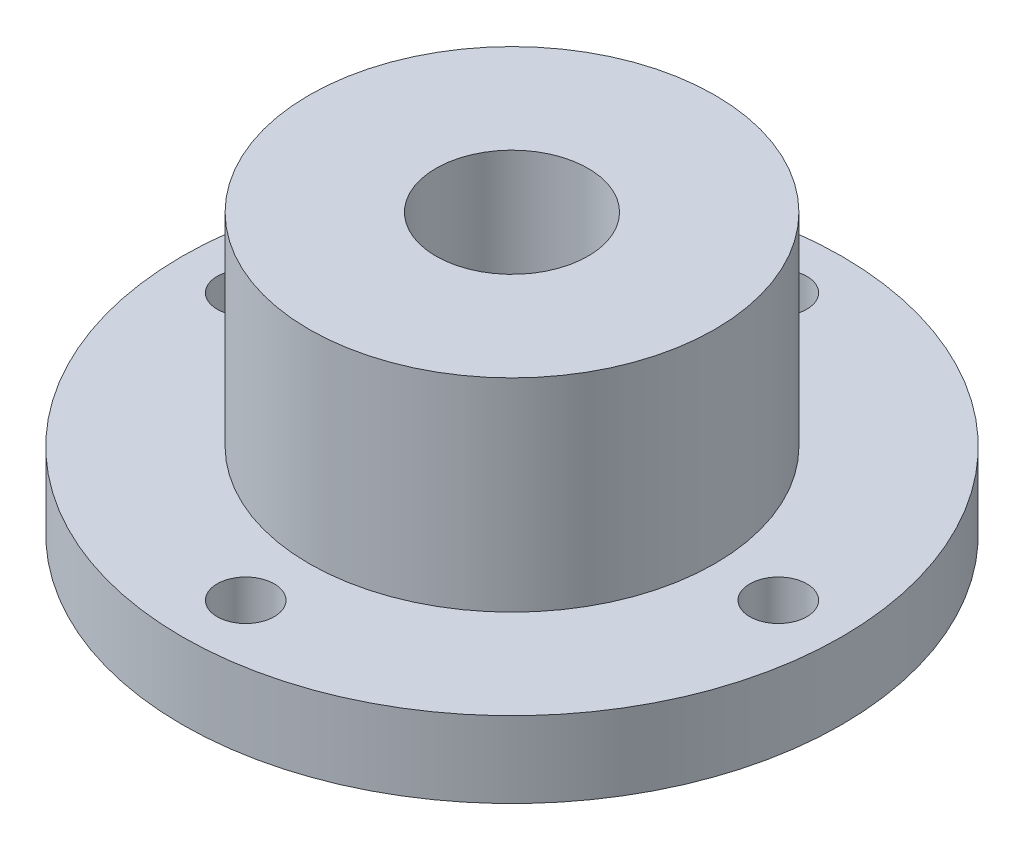
ISO-10303-21;
HEADER;
FILE_DESCRIPTION(('STEP AP214'),'2;1');
FILE_NAME('part.step','',(''),(''),'','','');
FILE_SCHEMA(('AUTOMOTIVE_DESIGN { 1 0 10303 214 1 1 1 1 }'));
ENDSEC;
DATA;
#1=APPLICATION_CONTEXT('core data for automotive mechanical design processes');
#2=APPLICATION_PROTOCOL_DEFINITION('international standard','automotive_design',2000,#1);
#3=PRODUCT_CONTEXT('',#1,'mechanical');
#4=PRODUCT('Part','Part','',(#3));
#5=PRODUCT_RELATED_PRODUCT_CATEGORY('part','',(#4));
#6=PRODUCT_DEFINITION_FORMATION('','',#4);
#7=PRODUCT_DEFINITION_CONTEXT('part definition',#1,'design');
#8=PRODUCT_DEFINITION('design','',#6,#7);
#9=PRODUCT_DEFINITION_SHAPE('','',#8);
#10=(LENGTH_UNIT() NAMED_UNIT(*) SI_UNIT(.MILLI.,.METRE.));
#11=(NAMED_UNIT(*) PLANE_ANGLE_UNIT() SI_UNIT($,.RADIAN.));
#12=(NAMED_UNIT(*) SI_UNIT($,.STERADIAN.) SOLID_ANGLE_UNIT());
#13=UNCERTAINTY_MEASURE_WITH_UNIT(LENGTH_MEASURE(1.E-05),#10,'distance_accuracy_value','');
#14=(GEOMETRIC_REPRESENTATION_CONTEXT(3) GLOBAL_UNCERTAINTY_ASSIGNED_CONTEXT((#13)) GLOBAL_UNIT_ASSIGNED_CONTEXT((#10,
#11,#12)) REPRESENTATION_CONTEXT('',''));
#15=CARTESIAN_POINT('',(0.,0.,0.));
#16=DIRECTION('',(0.,0.,1.));
#17=DIRECTION('',(1.,0.,0.));
#18=AXIS2_PLACEMENT_3D('',#15,#16,#17);
#19=CARTESIAN_POINT('',(-21.,6.,0.));
#20=DIRECTION('',(0.,-1.,0.));
#21=DIRECTION('',(0.,0.,-1.));
#22=AXIS2_PLACEMENT_3D('',#19,#20,#21);
#23=CYLINDRICAL_SURFACE('',#22,2.25);
#24=CARTESIAN_POINT('',(-21.,6.,0.));
#25=DIRECTION('',(0.,1.,0.));
#26=DIRECTION('',(0.,0.,1.));
#27=AXIS2_PLACEMENT_3D('',#24,#25,#26);
#28=CIRCLE('',#27,2.25);
#29=CARTESIAN_POINT('',(-21.,6.,2.25));
#30=VERTEX_POINT('',#29);
#31=EDGE_CURVE('E52',#30,#30,#28,.T.);
#32=ORIENTED_EDGE('',*,*,#31,.T.);
#33=EDGE_LOOP('',(#32));
#34=FACE_BOUND('',#33,.T.);
#35=CARTESIAN_POINT('',(-21.,0.,0.));
#36=DIRECTION('',(0.,1.,0.));
#37=DIRECTION('',(0.,0.,1.));
#38=AXIS2_PLACEMENT_3D('',#35,#36,#37);
#39=CIRCLE('',#38,2.25);
#40=CARTESIAN_POINT('',(-21.,0.,2.25));
#41=VERTEX_POINT('',#40);
#42=EDGE_CURVE('E68',#41,#41,#39,.T.);
#43=ORIENTED_EDGE('',*,*,#42,.F.);
#44=EDGE_LOOP('',(#43));
#45=FACE_BOUND('',#44,.T.);
#46=ADVANCED_FACE('F37',(#34,#45),#23,.F.);
#47=CARTESIAN_POINT('',(0.,6.,-21.));
#48=DIRECTION('',(0.,-1.,0.));
#49=DIRECTION('',(0.,0.,-1.));
#50=AXIS2_PLACEMENT_3D('',#47,#48,#49);
#51=CYLINDRICAL_SURFACE('',#50,2.25);
#52=CARTESIAN_POINT('',(0.,6.,-21.));
#53=DIRECTION('',(0.,1.,0.));
#54=DIRECTION('',(0.,0.,1.));
#55=AXIS2_PLACEMENT_3D('',#52,#53,#54);
#56=CIRCLE('',#55,2.25);
#57=CARTESIAN_POINT('',(0.,6.,-18.75));
#58=VERTEX_POINT('',#57);
#59=EDGE_CURVE('E86',#58,#58,#56,.T.);
#60=ORIENTED_EDGE('',*,*,#59,.T.);
#61=EDGE_LOOP('',(#60));
#62=FACE_BOUND('',#61,.T.);
#63=CARTESIAN_POINT('',(0.,0.,-21.));
#64=DIRECTION('',(0.,1.,0.));
#65=DIRECTION('',(0.,0.,1.));
#66=AXIS2_PLACEMENT_3D('',#63,#64,#65);
#67=CIRCLE('',#66,2.25);
#68=CARTESIAN_POINT('',(0.,0.,-18.75));
#69=VERTEX_POINT('',#68);
#70=EDGE_CURVE('E65',#69,#69,#67,.T.);
#71=ORIENTED_EDGE('',*,*,#70,.F.);
#72=EDGE_LOOP('',(#71));
#73=FACE_BOUND('',#72,.T.);
#74=ADVANCED_FACE('F138',(#62,#73),#51,.F.);
#75=CARTESIAN_POINT('',(21.,6.,0.));
#76=DIRECTION('',(0.,-1.,0.));
#77=DIRECTION('',(0.,0.,-1.));
#78=AXIS2_PLACEMENT_3D('',#75,#76,#77);
#79=CYLINDRICAL_SURFACE('',#78,2.25);
#80=CARTESIAN_POINT('',(21.,6.,0.));
#81=DIRECTION('',(0.,1.,0.));
#82=DIRECTION('',(0.,0.,1.));
#83=AXIS2_PLACEMENT_3D('',#80,#81,#82);
#84=CIRCLE('',#83,2.25);
#85=CARTESIAN_POINT('',(21.,6.,2.25));
#86=VERTEX_POINT('',#85);
#87=EDGE_CURVE('E80',#86,#86,#84,.T.);
#88=ORIENTED_EDGE('',*,*,#87,.T.);
#89=EDGE_LOOP('',(#88));
#90=FACE_BOUND('',#89,.T.);
#91=CARTESIAN_POINT('',(21.,0.,0.));
#92=DIRECTION('',(0.,1.,0.));
#93=DIRECTION('',(0.,0.,1.));
#94=AXIS2_PLACEMENT_3D('',#91,#92,#93);
#95=CIRCLE('',#94,2.25);
#96=CARTESIAN_POINT('',(21.,0.,2.25));
#97=VERTEX_POINT('',#96);
#98=EDGE_CURVE('E60',#97,#97,#95,.T.);
#99=ORIENTED_EDGE('',*,*,#98,.F.);
#100=EDGE_LOOP('',(#99));
#101=FACE_BOUND('',#100,.T.);
#102=ADVANCED_FACE('F143',(#90,#101),#79,.F.);
#103=CARTESIAN_POINT('',(0.,6.,21.));
#104=DIRECTION('',(0.,-1.,0.));
#105=DIRECTION('',(0.,0.,-1.));
#106=AXIS2_PLACEMENT_3D('',#103,#104,#105);
#107=CYLINDRICAL_SURFACE('',#106,2.25);
#108=CARTESIAN_POINT('',(0.,6.,21.));
#109=DIRECTION('',(0.,1.,0.));
#110=DIRECTION('',(0.,0.,1.));
#111=AXIS2_PLACEMENT_3D('',#108,#109,#110);
#112=CIRCLE('',#111,2.25);
#113=CARTESIAN_POINT('',(0.,6.,23.25));
#114=VERTEX_POINT('',#113);
#115=EDGE_CURVE('E75',#114,#114,#112,.T.);
#116=ORIENTED_EDGE('',*,*,#115,.T.);
#117=EDGE_LOOP('',(#116));
#118=FACE_BOUND('',#117,.T.);
#119=CARTESIAN_POINT('',(0.,0.,21.));
#120=DIRECTION('',(0.,1.,0.));
#121=DIRECTION('',(0.,0.,1.));
#122=AXIS2_PLACEMENT_3D('',#119,#120,#121);
#123=CIRCLE('',#122,2.25);
#124=CARTESIAN_POINT('',(0.,0.,23.25));
#125=VERTEX_POINT('',#124);
#126=EDGE_CURVE('E56',#125,#125,#123,.T.);
#127=ORIENTED_EDGE('',*,*,#126,.F.);
#128=EDGE_LOOP('',(#127));
#129=FACE_BOUND('',#128,.T.);
#130=ADVANCED_FACE('F39',(#118,#129),#107,.F.);
#131=CARTESIAN_POINT('',(0.,6.,0.));
#132=DIRECTION('',(0.,-1.,0.));
#133=DIRECTION('',(0.,0.,-1.));
#134=AXIS2_PLACEMENT_3D('',#131,#132,#133);
#135=CYLINDRICAL_SURFACE('',#134,26.);
#136=CARTESIAN_POINT('',(0.,6.,0.));
#137=DIRECTION('',(0.,1.,0.));
#138=DIRECTION('',(0.,0.,1.));
#139=AXIS2_PLACEMENT_3D('',#136,#137,#138);
#140=CIRCLE('',#139,26.);
#141=CARTESIAN_POINT('',(0.,6.,26.));
#142=VERTEX_POINT('',#141);
#143=EDGE_CURVE('E10',#142,#142,#140,.T.);
#144=ORIENTED_EDGE('',*,*,#143,.F.);
#145=EDGE_LOOP('',(#144));
#146=FACE_BOUND('',#145,.T.);
#147=CARTESIAN_POINT('',(0.,0.,0.));
#148=DIRECTION('',(0.,1.,0.));
#149=DIRECTION('',(0.,0.,1.));
#150=AXIS2_PLACEMENT_3D('',#147,#148,#149);
#151=CIRCLE('',#150,26.);
#152=CARTESIAN_POINT('',(0.,0.,26.));
#153=VERTEX_POINT('',#152);
#154=EDGE_CURVE('E41',#153,#153,#151,.T.);
#155=ORIENTED_EDGE('',*,*,#154,.T.);
#156=EDGE_LOOP('',(#155));
#157=FACE_BOUND('',#156,.T.);
#158=ADVANCED_FACE('F104',(#146,#157),#135,.T.);
#159=CARTESIAN_POINT('',(0.,6.,0.));
#160=DIRECTION('',(0.,1.,0.));
#161=DIRECTION('',(0.,0.,1.));
#162=AXIS2_PLACEMENT_3D('',#159,#160,#161);
#163=PLANE('',#162);
#164=ORIENTED_EDGE('',*,*,#115,.F.);
#165=EDGE_LOOP('',(#164));
#166=FACE_BOUND('',#165,.T.);
#167=ORIENTED_EDGE('',*,*,#87,.F.);
#168=EDGE_LOOP('',(#167));
#169=FACE_BOUND('',#168,.T.);
#170=ORIENTED_EDGE('',*,*,#59,.F.);
#171=EDGE_LOOP('',(#170));
#172=FACE_BOUND('',#171,.T.);
#173=ORIENTED_EDGE('',*,*,#31,.F.);
#174=EDGE_LOOP('',(#173));
#175=FACE_BOUND('',#174,.T.);
#176=CARTESIAN_POINT('',(0.,6.,0.));
#177=DIRECTION('',(0.,1.,0.));
#178=DIRECTION('',(0.,0.,1.));
#179=AXIS2_PLACEMENT_3D('',#176,#177,#178);
#180=CIRCLE('',#179,16.);
#181=CARTESIAN_POINT('',(0.,6.,16.));
#182=VERTEX_POINT('',#181);
#183=EDGE_CURVE('E46',#182,#182,#180,.T.);
#184=ORIENTED_EDGE('',*,*,#183,.F.);
#185=EDGE_LOOP('',(#184));
#186=FACE_BOUND('',#185,.T.);
#187=ORIENTED_EDGE('',*,*,#143,.T.);
#188=EDGE_LOOP('',(#187));
#189=FACE_BOUND('',#188,.T.);
#190=ADVANCED_FACE('F100',(#166,#169,#172,#175,#186,#189),#163,.T.);
#191=CARTESIAN_POINT('',(0.,0.,0.));
#192=DIRECTION('',(0.,1.,0.));
#193=DIRECTION('',(0.,0.,1.));
#194=AXIS2_PLACEMENT_3D('',#191,#192,#193);
#195=PLANE('',#194);
#196=ORIENTED_EDGE('',*,*,#126,.T.);
#197=EDGE_LOOP('',(#196));
#198=FACE_BOUND('',#197,.T.);
#199=ORIENTED_EDGE('',*,*,#98,.T.);
#200=EDGE_LOOP('',(#199));
#201=FACE_BOUND('',#200,.T.);
#202=ORIENTED_EDGE('',*,*,#70,.T.);
#203=EDGE_LOOP('',(#202));
#204=FACE_BOUND('',#203,.T.);
#205=ORIENTED_EDGE('',*,*,#42,.T.);
#206=EDGE_LOOP('',(#205));
#207=FACE_BOUND('',#206,.T.);
#208=ORIENTED_EDGE('',*,*,#154,.F.);
#209=EDGE_LOOP('',(#208));
#210=FACE_BOUND('',#209,.T.);
#211=CARTESIAN_POINT('',(0.,0.,0.));
#212=DIRECTION('',(0.,1.,0.));
#213=DIRECTION('',(0.,0.,1.));
#214=AXIS2_PLACEMENT_3D('',#211,#212,#213);
#215=CIRCLE('',#214,6.);
#216=CARTESIAN_POINT('',(0.,0.,6.));
#217=VERTEX_POINT('',#216);
#218=EDGE_CURVE('E89',#217,#217,#215,.T.);
#219=ORIENTED_EDGE('',*,*,#218,.T.);
#220=EDGE_LOOP('',(#219));
#221=FACE_BOUND('',#220,.T.);
#222=ADVANCED_FACE('F103',(#198,#201,#204,#207,#210,#221),#195,.F.);
#223=CARTESIAN_POINT('',(0.,22.,0.));
#224=DIRECTION('',(0.,-1.,0.));
#225=DIRECTION('',(0.,0.,-1.));
#226=AXIS2_PLACEMENT_3D('',#223,#224,#225);
#227=CYLINDRICAL_SURFACE('',#226,6.);
#228=CARTESIAN_POINT('',(0.,22.,0.));
#229=DIRECTION('',(0.,1.,0.));
#230=DIRECTION('',(0.,0.,1.));
#231=AXIS2_PLACEMENT_3D('',#228,#229,#230);
#232=CIRCLE('',#231,6.);
#233=CARTESIAN_POINT('',(0.,22.,6.));
#234=VERTEX_POINT('',#233);
#235=EDGE_CURVE('E119',#234,#234,#232,.T.);
#236=ORIENTED_EDGE('',*,*,#235,.T.);
#237=EDGE_LOOP('',(#236));
#238=FACE_BOUND('',#237,.T.);
#239=ORIENTED_EDGE('',*,*,#218,.F.);
#240=EDGE_LOOP('',(#239));
#241=FACE_BOUND('',#240,.T.);
#242=ADVANCED_FACE('F113',(#238,#241),#227,.F.);
#243=CARTESIAN_POINT('',(0.,22.,0.));
#244=DIRECTION('',(0.,-1.,0.));
#245=DIRECTION('',(0.,0.,-1.));
#246=AXIS2_PLACEMENT_3D('',#243,#244,#245);
#247=CYLINDRICAL_SURFACE('',#246,16.);
#248=ORIENTED_EDGE('',*,*,#183,.T.);
#249=EDGE_LOOP('',(#248));
#250=FACE_BOUND('',#249,.T.);
#251=CARTESIAN_POINT('',(0.,22.,0.));
#252=DIRECTION('',(0.,1.,0.));
#253=DIRECTION('',(0.,0.,1.));
#254=AXIS2_PLACEMENT_3D('',#251,#252,#253);
#255=CIRCLE('',#254,16.);
#256=CARTESIAN_POINT('',(0.,22.,16.));
#257=VERTEX_POINT('',#256);
#258=EDGE_CURVE('E61',#257,#257,#255,.T.);
#259=ORIENTED_EDGE('',*,*,#258,.F.);
#260=EDGE_LOOP('',(#259));
#261=FACE_BOUND('',#260,.T.);
#262=ADVANCED_FACE('F109',(#250,#261),#247,.T.);
#263=CARTESIAN_POINT('',(0.,22.,0.));
#264=DIRECTION('',(0.,1.,0.));
#265=DIRECTION('',(0.,0.,1.));
#266=AXIS2_PLACEMENT_3D('',#263,#264,#265);
#267=PLANE('',#266);
#268=ORIENTED_EDGE('',*,*,#235,.F.);
#269=EDGE_LOOP('',(#268));
#270=FACE_BOUND('',#269,.T.);
#271=ORIENTED_EDGE('',*,*,#258,.T.);
#272=EDGE_LOOP('',(#271));
#273=FACE_BOUND('',#272,.T.);
#274=ADVANCED_FACE('F112',(#270,#273),#267,.T.);
#275=CLOSED_SHELL('',(#46,#74,#102,#130,#158,#190,#222,#242,#262,#274));
#276=MANIFOLD_SOLID_BREP('B2',#275);
#277=ADVANCED_BREP_SHAPE_REPRESENTATION('',(#18,#276),#14);
#278=SHAPE_DEFINITION_REPRESENTATION(#9,#277);
ENDSEC;
END-ISO-10303-21;
